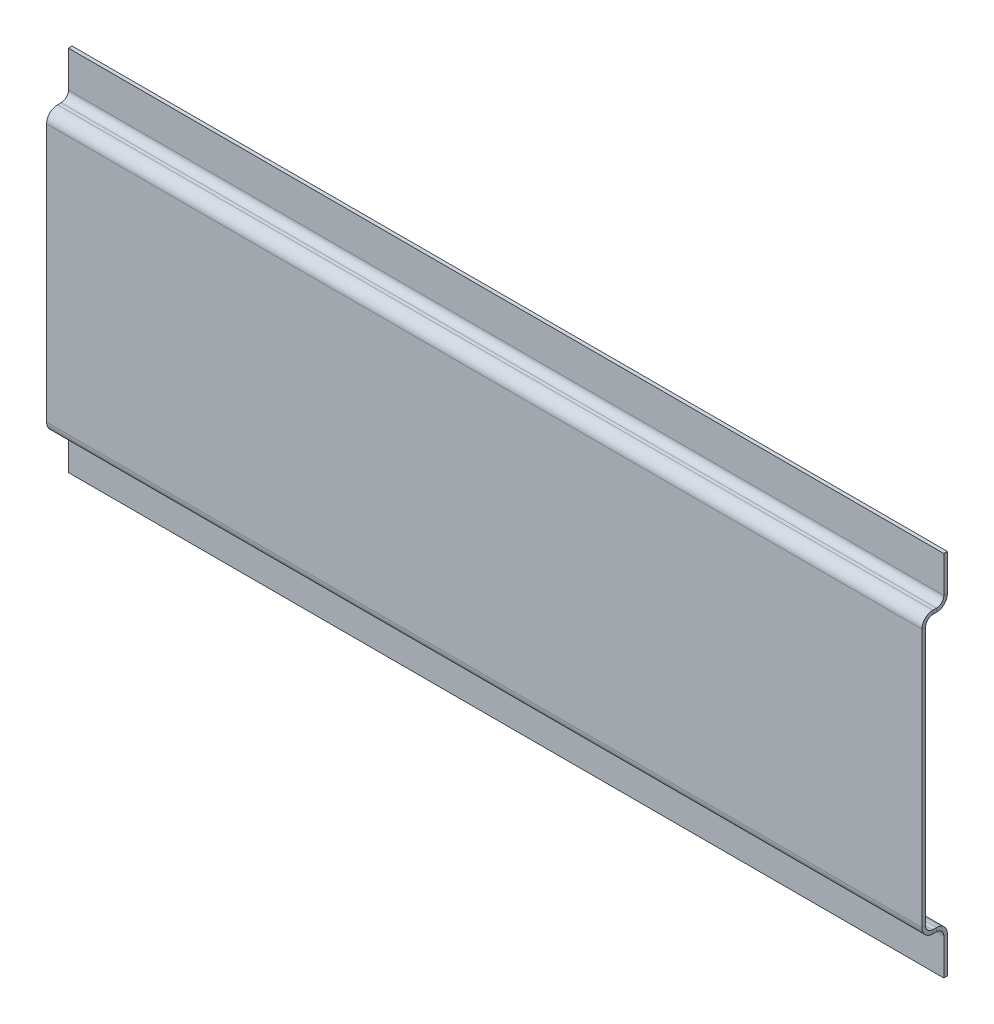
ISO-10303-21;
HEADER;
FILE_DESCRIPTION(('STEP AP214'),'2;1');
FILE_NAME('part.step','',(''),(''),'','','');
FILE_SCHEMA(('AUTOMOTIVE_DESIGN { 1 0 10303 214 1 1 1 1 }'));
ENDSEC;
DATA;
#1=APPLICATION_CONTEXT('core data for automotive mechanical design processes');
#2=APPLICATION_PROTOCOL_DEFINITION('international standard','automotive_design',2000,#1);
#3=PRODUCT_CONTEXT('',#1,'mechanical');
#4=PRODUCT('Part','Part','',(#3));
#5=PRODUCT_RELATED_PRODUCT_CATEGORY('part','',(#4));
#6=PRODUCT_DEFINITION_FORMATION('','',#4);
#7=PRODUCT_DEFINITION_CONTEXT('part definition',#1,'design');
#8=PRODUCT_DEFINITION('design','',#6,#7);
#9=PRODUCT_DEFINITION_SHAPE('','',#8);
#10=(LENGTH_UNIT() NAMED_UNIT(*) SI_UNIT(.MILLI.,.METRE.));
#11=(NAMED_UNIT(*) PLANE_ANGLE_UNIT() SI_UNIT($,.RADIAN.));
#12=(NAMED_UNIT(*) SI_UNIT($,.STERADIAN.) SOLID_ANGLE_UNIT());
#13=UNCERTAINTY_MEASURE_WITH_UNIT(LENGTH_MEASURE(1.E-05),#10,'distance_accuracy_value','');
#14=(GEOMETRIC_REPRESENTATION_CONTEXT(3) GLOBAL_UNCERTAINTY_ASSIGNED_CONTEXT((#13)) GLOBAL_UNIT_ASSIGNED_CONTEXT((#10,
#11,#12)) REPRESENTATION_CONTEXT('',''));
#15=CARTESIAN_POINT('',(0.,0.,0.));
#16=DIRECTION('',(0.,0.,1.));
#17=DIRECTION('',(1.,0.,0.));
#18=AXIS2_PLACEMENT_3D('',#15,#16,#17);
#19=CARTESIAN_POINT('',(0.,3.8539816339745,5.00000000000001));
#20=DIRECTION('',(0.,0.,1.));
#21=DIRECTION('',(1.,0.,0.));
#22=AXIS2_PLACEMENT_3D('',#19,#20,#21);
#23=PLANE('',#22);
#24=DIRECTION('',(0.,1.,0.));
#25=VECTOR('',#24,1.);
#26=CARTESIAN_POINT('',(120.25,54.3539816339745,5.));
#27=LINE('',#26,#25);
#28=CARTESIAN_POINT('',(120.25,-35.5,5.));
#29=VERTEX_POINT('',#28);
#30=CARTESIAN_POINT('',(120.25,35.5,5.00000000000001));
#31=VERTEX_POINT('',#30);
#32=EDGE_CURVE('E278',#29,#31,#27,.T.);
#33=ORIENTED_EDGE('',*,*,#32,.F.);
#34=DIRECTION('',(-1.,0.,0.));
#35=VECTOR('',#34,1.);
#36=CARTESIAN_POINT('',(0.,-35.5,5.00000000000001));
#37=LINE('',#36,#35);
#38=CARTESIAN_POINT('',(-120.25,-35.5,5.00000000000001));
#39=VERTEX_POINT('',#38);
#40=EDGE_CURVE('E358',#29,#39,#37,.T.);
#41=ORIENTED_EDGE('',*,*,#40,.T.);
#42=DIRECTION('',(0.,-1.,0.));
#43=VECTOR('',#42,1.);
#44=CARTESIAN_POINT('',(-120.25,54.3539816339745,5.));
#45=LINE('',#44,#43);
#46=CARTESIAN_POINT('',(-120.25,35.5,5.00000000000001));
#47=VERTEX_POINT('',#46);
#48=EDGE_CURVE('E357',#47,#39,#45,.T.);
#49=ORIENTED_EDGE('',*,*,#48,.F.);
#50=DIRECTION('',(-1.,0.,0.));
#51=VECTOR('',#50,1.);
#52=CARTESIAN_POINT('',(0.,35.5,5.00000000000001));
#53=LINE('',#52,#51);
#54=EDGE_CURVE('E279',#31,#47,#53,.T.);
#55=ORIENTED_EDGE('',*,*,#54,.F.);
#56=EDGE_LOOP('',(#33,#41,#49,#55));
#57=FACE_BOUND('',#56,.T.);
#58=ADVANCED_FACE('F53',(#57),#23,.F.);
#59=CARTESIAN_POINT('',(0.,37.5000000000001,38.5730091830128));
#60=DIRECTION('',(0.,1.,0.));
#61=DIRECTION('',(1.,0.,0.));
#62=AXIS2_PLACEMENT_3D('',#59,#60,#61);
#63=PLANE('',#62);
#64=DIRECTION('',(0.,0.,-1.));
#65=VECTOR('',#64,1.);
#66=CARTESIAN_POINT('',(120.25,37.5,-11.9269908169872));
#67=LINE('',#66,#65);
#68=CARTESIAN_POINT('',(120.25,37.5,3.));
#69=VERTEX_POINT('',#68);
#70=CARTESIAN_POINT('',(120.25,37.5,2.));
#71=VERTEX_POINT('',#70);
#72=EDGE_CURVE('E258',#69,#71,#67,.T.);
#73=ORIENTED_EDGE('',*,*,#72,.F.);
#74=DIRECTION('',(-1.,0.,0.));
#75=VECTOR('',#74,1.);
#76=CARTESIAN_POINT('',(0.,37.5,3.));
#77=LINE('',#76,#75);
#78=CARTESIAN_POINT('',(-120.25,37.5,3.));
#79=VERTEX_POINT('',#78);
#80=EDGE_CURVE('E252',#69,#79,#77,.T.);
#81=ORIENTED_EDGE('',*,*,#80,.T.);
#82=DIRECTION('',(0.,0.,1.));
#83=VECTOR('',#82,1.);
#84=CARTESIAN_POINT('',(-120.25,37.5,-11.9269908169872));
#85=LINE('',#84,#83);
#86=CARTESIAN_POINT('',(-120.25,37.5,2.00000000000001));
#87=VERTEX_POINT('',#86);
#88=EDGE_CURVE('E264',#87,#79,#85,.T.);
#89=ORIENTED_EDGE('',*,*,#88,.F.);
#90=DIRECTION('',(-1.,0.,0.));
#91=VECTOR('',#90,1.);
#92=CARTESIAN_POINT('',(0.,37.5,2.));
#93=LINE('',#92,#91);
#94=EDGE_CURVE('E292',#71,#87,#93,.T.);
#95=ORIENTED_EDGE('',*,*,#94,.F.);
#96=EDGE_LOOP('',(#73,#81,#89,#95));
#97=FACE_BOUND('',#96,.T.);
#98=ADVANCED_FACE('F432',(#97),#63,.F.);
#99=CARTESIAN_POINT('',(120.25,37.5,-11.9269908169872));
#100=DIRECTION('',(1.,0.,0.));
#101=DIRECTION('',(0.,0.,-1.));
#102=AXIS2_PLACEMENT_3D('',#99,#100,#101);
#103=PLANE('',#102);
#104=DIRECTION('',(0.,1.,0.));
#105=VECTOR('',#104,1.);
#106=CARTESIAN_POINT('',(120.25,37.4999999999999,3.));
#107=LINE('',#106,#105);
#108=CARTESIAN_POINT('',(120.25,38.5,3.));
#109=VERTEX_POINT('',#108);
#110=EDGE_CURVE('E280',#69,#109,#107,.T.);
#111=ORIENTED_EDGE('',*,*,#110,.F.);
#112=ORIENTED_EDGE('',*,*,#72,.T.);
#113=DIRECTION('',(0.,1.,0.));
#114=VECTOR('',#113,1.);
#115=CARTESIAN_POINT('',(120.25,37.4999999999999,2.));
#116=LINE('',#115,#114);
#117=CARTESIAN_POINT('',(120.25,38.5,2.));
#118=VERTEX_POINT('',#117);
#119=EDGE_CURVE('E260',#71,#118,#116,.T.);
#120=ORIENTED_EDGE('',*,*,#119,.T.);
#121=DIRECTION('',(0.,0.,-1.));
#122=VECTOR('',#121,1.);
#123=CARTESIAN_POINT('',(120.25,38.5,-11.9269908169873));
#124=LINE('',#123,#122);
#125=EDGE_CURVE('E261',#109,#118,#124,.T.);
#126=ORIENTED_EDGE('',*,*,#125,.F.);
#127=EDGE_LOOP('',(#111,#112,#120,#126));
#128=FACE_BOUND('',#127,.T.);
#129=ADVANCED_FACE('F474',(#128),#103,.T.);
#130=CARTESIAN_POINT('',(-120.25,37.5,-11.9269908169872));
#131=DIRECTION('',(-1.,0.,0.));
#132=DIRECTION('',(0.,0.,1.));
#133=AXIS2_PLACEMENT_3D('',#130,#131,#132);
#134=PLANE('',#133);
#135=DIRECTION('',(0.,-1.,0.));
#136=VECTOR('',#135,1.);
#137=CARTESIAN_POINT('',(-120.25,37.4999999999999,3.));
#138=LINE('',#137,#136);
#139=CARTESIAN_POINT('',(-120.25,38.5,3.00000000000001));
#140=VERTEX_POINT('',#139);
#141=EDGE_CURVE('E270',#140,#79,#138,.T.);
#142=ORIENTED_EDGE('',*,*,#141,.F.);
#143=DIRECTION('',(0.,0.,1.));
#144=VECTOR('',#143,1.);
#145=CARTESIAN_POINT('',(-120.25,38.5,-11.9269908169872));
#146=LINE('',#145,#144);
#147=CARTESIAN_POINT('',(-120.25,38.5,2.00000000000001));
#148=VERTEX_POINT('',#147);
#149=EDGE_CURVE('E265',#148,#140,#146,.T.);
#150=ORIENTED_EDGE('',*,*,#149,.F.);
#151=DIRECTION('',(0.,-1.,0.));
#152=VECTOR('',#151,1.);
#153=CARTESIAN_POINT('',(-120.25,37.4999999999999,2.00000000000001));
#154=LINE('',#153,#152);
#155=EDGE_CURVE('E269',#148,#87,#154,.T.);
#156=ORIENTED_EDGE('',*,*,#155,.T.);
#157=ORIENTED_EDGE('',*,*,#88,.T.);
#158=EDGE_LOOP('',(#142,#150,#156,#157));
#159=FACE_BOUND('',#158,.T.);
#160=ADVANCED_FACE('F440',(#159),#134,.T.);
#161=CARTESIAN_POINT('',(0.,38.5000000000001,38.5730091830128));
#162=DIRECTION('',(0.,1.,0.));
#163=DIRECTION('',(1.,0.,0.));
#164=AXIS2_PLACEMENT_3D('',#161,#162,#163);
#165=PLANE('',#164);
#166=DIRECTION('',(-1.,0.,0.));
#167=VECTOR('',#166,1.);
#168=CARTESIAN_POINT('',(0.,38.5,3.));
#169=LINE('',#168,#167);
#170=EDGE_CURVE('E275',#109,#140,#169,.T.);
#171=ORIENTED_EDGE('',*,*,#170,.F.);
#172=ORIENTED_EDGE('',*,*,#125,.T.);
#173=DIRECTION('',(-1.,0.,0.));
#174=VECTOR('',#173,1.);
#175=CARTESIAN_POINT('',(0.,38.5,2.));
#176=LINE('',#175,#174);
#177=EDGE_CURVE('E263',#118,#148,#176,.T.);
#178=ORIENTED_EDGE('',*,*,#177,.T.);
#179=ORIENTED_EDGE('',*,*,#149,.T.);
#180=EDGE_LOOP('',(#171,#172,#178,#179));
#181=FACE_BOUND('',#180,.T.);
#182=ADVANCED_FACE('F479',(#181),#165,.T.);
#183=CARTESIAN_POINT('',(-120.25,50.5,-1.));
#184=DIRECTION('',(0.,1.,0.));
#185=DIRECTION('',(0.,0.,1.));
#186=AXIS2_PLACEMENT_3D('',#183,#184,#185);
#187=PLANE('',#186);
#188=DIRECTION('',(-1.,0.,0.));
#189=VECTOR('',#188,1.);
#190=CARTESIAN_POINT('',(-120.25,50.5,0.));
#191=LINE('',#190,#189);
#192=CARTESIAN_POINT('',(120.25,50.5,0.));
#193=VERTEX_POINT('',#192);
#194=CARTESIAN_POINT('',(-120.25,50.5,0.));
#195=VERTEX_POINT('',#194);
#196=EDGE_CURVE('E319',#193,#195,#191,.T.);
#197=ORIENTED_EDGE('',*,*,#196,.F.);
#198=DIRECTION('',(0.,0.,1.));
#199=VECTOR('',#198,1.);
#200=CARTESIAN_POINT('',(120.25,50.5,-1.));
#201=LINE('',#200,#199);
#202=CARTESIAN_POINT('',(120.25,50.5,-1.));
#203=VERTEX_POINT('',#202);
#204=EDGE_CURVE('E300',#203,#193,#201,.T.);
#205=ORIENTED_EDGE('',*,*,#204,.F.);
#206=DIRECTION('',(-1.,0.,0.));
#207=VECTOR('',#206,1.);
#208=CARTESIAN_POINT('',(-120.25,50.5,-1.));
#209=LINE('',#208,#207);
#210=CARTESIAN_POINT('',(-120.25,50.5,-1.));
#211=VERTEX_POINT('',#210);
#212=EDGE_CURVE('E267',#203,#211,#209,.T.);
#213=ORIENTED_EDGE('',*,*,#212,.T.);
#214=DIRECTION('',(0.,0.,1.));
#215=VECTOR('',#214,1.);
#216=CARTESIAN_POINT('',(-120.25,50.5,-1.));
#217=LINE('',#216,#215);
#218=EDGE_CURVE('E310',#211,#195,#217,.T.);
#219=ORIENTED_EDGE('',*,*,#218,.T.);
#220=EDGE_LOOP('',(#197,#205,#213,#219));
#221=FACE_BOUND('',#220,.T.);
#222=ADVANCED_FACE('F467',(#221),#187,.T.);
#223=CARTESIAN_POINT('',(0.,0.,-1.));
#224=DIRECTION('',(0.,0.,1.));
#225=DIRECTION('',(1.,0.,0.));
#226=AXIS2_PLACEMENT_3D('',#223,#224,#225);
#227=PLANE('',#226);
#228=DIRECTION('',(0.,1.,0.));
#229=VECTOR('',#228,1.);
#230=CARTESIAN_POINT('',(120.25,50.5,-1.));
#231=LINE('',#230,#229);
#232=CARTESIAN_POINT('',(120.25,40.5,-1.));
#233=VERTEX_POINT('',#232);
#234=EDGE_CURVE('E324',#233,#203,#231,.T.);
#235=ORIENTED_EDGE('',*,*,#234,.F.);
#236=DIRECTION('',(-1.,0.,0.));
#237=VECTOR('',#236,1.);
#238=CARTESIAN_POINT('',(0.,40.5,-1.));
#239=LINE('',#238,#237);
#240=CARTESIAN_POINT('',(-120.25,40.5,-1.));
#241=VERTEX_POINT('',#240);
#242=EDGE_CURVE('E312',#233,#241,#239,.T.);
#243=ORIENTED_EDGE('',*,*,#242,.T.);
#244=DIRECTION('',(0.,-1.,0.));
#245=VECTOR('',#244,1.);
#246=CARTESIAN_POINT('',(-120.25,50.5,-1.));
#247=LINE('',#246,#245);
#248=EDGE_CURVE('E315',#211,#241,#247,.T.);
#249=ORIENTED_EDGE('',*,*,#248,.F.);
#250=ORIENTED_EDGE('',*,*,#212,.F.);
#251=EDGE_LOOP('',(#235,#243,#249,#250));
#252=FACE_BOUND('',#251,.T.);
#253=ADVANCED_FACE('F486',(#252),#227,.F.);
#254=CARTESIAN_POINT('',(-120.25,50.5,-1.));
#255=DIRECTION('',(-1.,0.,0.));
#256=DIRECTION('',(0.,-1.,0.));
#257=AXIS2_PLACEMENT_3D('',#254,#255,#256);
#258=PLANE('',#257);
#259=DIRECTION('',(0.,0.,-1.));
#260=VECTOR('',#259,1.);
#261=CARTESIAN_POINT('',(-120.25,40.5,-1.00000000000007));
#262=LINE('',#261,#260);
#263=CARTESIAN_POINT('',(-120.25,40.5,0.));
#264=VERTEX_POINT('',#263);
#265=EDGE_CURVE('E303',#264,#241,#262,.T.);
#266=ORIENTED_EDGE('',*,*,#265,.F.);
#267=DIRECTION('',(0.,-1.,0.));
#268=VECTOR('',#267,1.);
#269=CARTESIAN_POINT('',(-120.25,50.5,0.));
#270=LINE('',#269,#268);
#271=EDGE_CURVE('E322',#195,#264,#270,.T.);
#272=ORIENTED_EDGE('',*,*,#271,.F.);
#273=ORIENTED_EDGE('',*,*,#218,.F.);
#274=ORIENTED_EDGE('',*,*,#248,.T.);
#275=EDGE_LOOP('',(#266,#272,#273,#274));
#276=FACE_BOUND('',#275,.T.);
#277=ADVANCED_FACE('F470',(#276),#258,.T.);
#278=CARTESIAN_POINT('',(0.,0.,0.));
#279=DIRECTION('',(0.,0.,1.));
#280=DIRECTION('',(1.,0.,0.));
#281=AXIS2_PLACEMENT_3D('',#278,#279,#280);
#282=PLANE('',#281);
#283=DIRECTION('',(-1.,0.,0.));
#284=VECTOR('',#283,1.);
#285=CARTESIAN_POINT('',(0.,40.5,0.));
#286=LINE('',#285,#284);
#287=CARTESIAN_POINT('',(120.25,40.5,0.));
#288=VERTEX_POINT('',#287);
#289=EDGE_CURVE('E284',#288,#264,#286,.T.);
#290=ORIENTED_EDGE('',*,*,#289,.F.);
#291=DIRECTION('',(0.,1.,0.));
#292=VECTOR('',#291,1.);
#293=CARTESIAN_POINT('',(120.25,50.5,0.));
#294=LINE('',#293,#292);
#295=EDGE_CURVE('E317',#288,#193,#294,.T.);
#296=ORIENTED_EDGE('',*,*,#295,.T.);
#297=ORIENTED_EDGE('',*,*,#196,.T.);
#298=ORIENTED_EDGE('',*,*,#271,.T.);
#299=EDGE_LOOP('',(#290,#296,#297,#298));
#300=FACE_BOUND('',#299,.T.);
#301=ADVANCED_FACE('F452',(#300),#282,.T.);
#302=CARTESIAN_POINT('',(120.25,50.5,-1.));
#303=DIRECTION('',(1.,0.,0.));
#304=DIRECTION('',(0.,1.,0.));
#305=AXIS2_PLACEMENT_3D('',#302,#303,#304);
#306=PLANE('',#305);
#307=DIRECTION('',(0.,0.,1.));
#308=VECTOR('',#307,1.);
#309=CARTESIAN_POINT('',(120.25,40.5,-1.00000000000007));
#310=LINE('',#309,#308);
#311=EDGE_CURVE('E296',#233,#288,#310,.T.);
#312=ORIENTED_EDGE('',*,*,#311,.F.);
#313=ORIENTED_EDGE('',*,*,#234,.T.);
#314=ORIENTED_EDGE('',*,*,#204,.T.);
#315=ORIENTED_EDGE('',*,*,#295,.F.);
#316=EDGE_LOOP('',(#312,#313,#314,#315));
#317=FACE_BOUND('',#316,.T.);
#318=ADVANCED_FACE('F462',(#317),#306,.T.);
#319=CARTESIAN_POINT('',(120.25,40.5,2.));
#320=DIRECTION('',(1.,0.,0.));
#321=DIRECTION('',(0.,0.,-1.));
#322=AXIS2_PLACEMENT_3D('',#319,#320,#321);
#323=PLANE('',#322);
#324=ORIENTED_EDGE('',*,*,#311,.T.);
#325=CARTESIAN_POINT('',(120.25,40.5,2.));
#326=DIRECTION('',(-1.,0.,0.));
#327=DIRECTION('',(0.,-1.,0.));
#328=AXIS2_PLACEMENT_3D('',#325,#326,#327);
#329=CIRCLE('',#328,2.);
#330=EDGE_CURVE('E299',#288,#118,#329,.T.);
#331=ORIENTED_EDGE('',*,*,#330,.T.);
#332=ORIENTED_EDGE('',*,*,#119,.F.);
#333=CARTESIAN_POINT('',(120.25,40.5,2.));
#334=DIRECTION('',(-1.,0.,0.));
#335=DIRECTION('',(0.,0.,-1.));
#336=AXIS2_PLACEMENT_3D('',#333,#334,#335);
#337=CIRCLE('',#336,3.);
#338=EDGE_CURVE('E295',#233,#71,#337,.T.);
#339=ORIENTED_EDGE('',*,*,#338,.F.);
#340=EDGE_LOOP('',(#324,#331,#332,#339));
#341=FACE_BOUND('',#340,.T.);
#342=ADVANCED_FACE('F458',(#341),#323,.T.);
#343=CARTESIAN_POINT('',(-120.25,40.5,2.));
#344=DIRECTION('',(-1.,0.,0.));
#345=DIRECTION('',(0.,0.,1.));
#346=AXIS2_PLACEMENT_3D('',#343,#344,#345);
#347=PLANE('',#346);
#348=ORIENTED_EDGE('',*,*,#155,.F.);
#349=CARTESIAN_POINT('',(-120.25,40.5,2.));
#350=DIRECTION('',(-1.,0.,0.));
#351=DIRECTION('',(0.,-1.,0.));
#352=AXIS2_PLACEMENT_3D('',#349,#350,#351);
#353=CIRCLE('',#352,2.);
#354=EDGE_CURVE('E307',#148,#264,#353,.F.);
#355=ORIENTED_EDGE('',*,*,#354,.T.);
#356=ORIENTED_EDGE('',*,*,#265,.T.);
#357=CARTESIAN_POINT('',(-120.25,40.5,2.));
#358=DIRECTION('',(1.,0.,0.));
#359=DIRECTION('',(0.,0.,1.));
#360=AXIS2_PLACEMENT_3D('',#357,#358,#359);
#361=CIRCLE('',#360,3.);
#362=EDGE_CURVE('E306',#87,#241,#361,.T.);
#363=ORIENTED_EDGE('',*,*,#362,.F.);
#364=EDGE_LOOP('',(#348,#355,#356,#363));
#365=FACE_BOUND('',#364,.T.);
#366=ADVANCED_FACE('F445',(#365),#347,.T.);
#367=CARTESIAN_POINT('',(240.534137404396,40.5,2.));
#368=DIRECTION('',(-1.,0.,0.));
#369=DIRECTION('',(0.,-1.,0.));
#370=AXIS2_PLACEMENT_3D('',#367,#368,#369);
#371=CYLINDRICAL_SURFACE('',#370,3.);
#372=ORIENTED_EDGE('',*,*,#362,.T.);
#373=ORIENTED_EDGE('',*,*,#242,.F.);
#374=ORIENTED_EDGE('',*,*,#338,.T.);
#375=ORIENTED_EDGE('',*,*,#94,.T.);
#376=EDGE_LOOP('',(#372,#373,#374,#375));
#377=FACE_BOUND('',#376,.T.);
#378=ADVANCED_FACE('F472',(#377),#371,.T.);
#379=CARTESIAN_POINT('',(240.534137404396,40.5,2.));
#380=DIRECTION('',(-1.,0.,0.));
#381=DIRECTION('',(0.,-1.,0.));
#382=AXIS2_PLACEMENT_3D('',#379,#380,#381);
#383=CYLINDRICAL_SURFACE('',#382,2.);
#384=ORIENTED_EDGE('',*,*,#354,.F.);
#385=ORIENTED_EDGE('',*,*,#177,.F.);
#386=ORIENTED_EDGE('',*,*,#330,.F.);
#387=ORIENTED_EDGE('',*,*,#289,.T.);
#388=EDGE_LOOP('',(#384,#385,#386,#387));
#389=FACE_BOUND('',#388,.T.);
#390=ADVANCED_FACE('F448',(#389),#383,.F.);
#391=CARTESIAN_POINT('',(120.25,35.5,3.00000000000001));
#392=DIRECTION('',(-1.,0.,0.));
#393=DIRECTION('',(0.,0.,1.));
#394=AXIS2_PLACEMENT_3D('',#391,#392,#393);
#395=PLANE('',#394);
#396=ORIENTED_EDGE('',*,*,#110,.T.);
#397=CARTESIAN_POINT('',(120.25,35.5,3.00000000000001));
#398=DIRECTION('',(-1.,0.,0.));
#399=DIRECTION('',(0.,-1.,0.));
#400=AXIS2_PLACEMENT_3D('',#397,#398,#399);
#401=CIRCLE('',#400,3.);
#402=CARTESIAN_POINT('',(120.25,35.5,6.00000000000001));
#403=VERTEX_POINT('',#402);
#404=EDGE_CURVE('E283',#109,#403,#401,.F.);
#405=ORIENTED_EDGE('',*,*,#404,.T.);
#406=DIRECTION('',(0.,0.,1.));
#407=VECTOR('',#406,1.);
#408=CARTESIAN_POINT('',(120.25,35.5,4.99999999999988));
#409=LINE('',#408,#407);
#410=EDGE_CURVE('E347',#31,#403,#409,.T.);
#411=ORIENTED_EDGE('',*,*,#410,.F.);
#412=CARTESIAN_POINT('',(120.25,35.5,3.00000000000001));
#413=DIRECTION('',(1.,0.,0.));
#414=DIRECTION('',(0.,0.,1.));
#415=AXIS2_PLACEMENT_3D('',#412,#413,#414);
#416=CIRCLE('',#415,2.);
#417=EDGE_CURVE('E342',#69,#31,#416,.T.);
#418=ORIENTED_EDGE('',*,*,#417,.F.);
#419=EDGE_LOOP('',(#396,#405,#411,#418));
#420=FACE_BOUND('',#419,.T.);
#421=ADVANCED_FACE('F426',(#420),#395,.F.);
#422=CARTESIAN_POINT('',(-120.25,35.5,3.00000000000001));
#423=DIRECTION('',(1.,0.,0.));
#424=DIRECTION('',(0.,0.,-1.));
#425=AXIS2_PLACEMENT_3D('',#422,#423,#424);
#426=PLANE('',#425);
#427=DIRECTION('',(0.,0.,-1.));
#428=VECTOR('',#427,1.);
#429=CARTESIAN_POINT('',(-120.25,35.5,4.99999999999988));
#430=LINE('',#429,#428);
#431=CARTESIAN_POINT('',(-120.25,35.5,6.00000000000001));
#432=VERTEX_POINT('',#431);
#433=EDGE_CURVE('E355',#432,#47,#430,.T.);
#434=ORIENTED_EDGE('',*,*,#433,.F.);
#435=CARTESIAN_POINT('',(-120.25,35.5,3.00000000000001));
#436=DIRECTION('',(-1.,0.,0.));
#437=DIRECTION('',(0.,-1.,0.));
#438=AXIS2_PLACEMENT_3D('',#435,#436,#437);
#439=CIRCLE('',#438,3.);
#440=EDGE_CURVE('E274',#432,#140,#439,.T.);
#441=ORIENTED_EDGE('',*,*,#440,.T.);
#442=ORIENTED_EDGE('',*,*,#141,.T.);
#443=CARTESIAN_POINT('',(-120.25,35.5,3.00000000000001));
#444=DIRECTION('',(-1.,0.,0.));
#445=DIRECTION('',(0.,0.,-1.));
#446=AXIS2_PLACEMENT_3D('',#443,#444,#445);
#447=CIRCLE('',#446,2.);
#448=EDGE_CURVE('E273',#47,#79,#447,.T.);
#449=ORIENTED_EDGE('',*,*,#448,.F.);
#450=EDGE_LOOP('',(#434,#441,#442,#449));
#451=FACE_BOUND('',#450,.T.);
#452=ADVANCED_FACE('F437',(#451),#426,.F.);
#453=CARTESIAN_POINT('',(240.534137404396,35.5,3.00000000000001));
#454=DIRECTION('',(-1.,0.,0.));
#455=DIRECTION('',(0.,-1.,0.));
#456=AXIS2_PLACEMENT_3D('',#453,#454,#455);
#457=CYLINDRICAL_SURFACE('',#456,2.);
#458=ORIENTED_EDGE('',*,*,#448,.T.);
#459=ORIENTED_EDGE('',*,*,#80,.F.);
#460=ORIENTED_EDGE('',*,*,#417,.T.);
#461=ORIENTED_EDGE('',*,*,#54,.T.);
#462=EDGE_LOOP('',(#458,#459,#460,#461));
#463=FACE_BOUND('',#462,.T.);
#464=ADVANCED_FACE('F429',(#463),#457,.F.);
#465=CARTESIAN_POINT('',(240.534137404396,35.5,3.00000000000001));
#466=DIRECTION('',(-1.,0.,0.));
#467=DIRECTION('',(0.,-1.,0.));
#468=AXIS2_PLACEMENT_3D('',#465,#466,#467);
#469=CYLINDRICAL_SURFACE('',#468,3.);
#470=ORIENTED_EDGE('',*,*,#440,.F.);
#471=DIRECTION('',(-1.,0.,0.));
#472=VECTOR('',#471,1.);
#473=CARTESIAN_POINT('',(0.,35.5,6.00000000000001));
#474=LINE('',#473,#472);
#475=EDGE_CURVE('E351',#403,#432,#474,.T.);
#476=ORIENTED_EDGE('',*,*,#475,.F.);
#477=ORIENTED_EDGE('',*,*,#404,.F.);
#478=ORIENTED_EDGE('',*,*,#170,.T.);
#479=EDGE_LOOP('',(#470,#476,#477,#478));
#480=FACE_BOUND('',#479,.T.);
#481=ADVANCED_FACE('F477',(#480),#469,.T.);
#482=CARTESIAN_POINT('',(120.25,54.3539816339745,5.));
#483=DIRECTION('',(1.,0.,0.));
#484=DIRECTION('',(0.,1.,0.));
#485=AXIS2_PLACEMENT_3D('',#482,#483,#484);
#486=PLANE('',#485);
#487=DIRECTION('',(0.,0.,1.));
#488=VECTOR('',#487,1.);
#489=CARTESIAN_POINT('',(120.25,-35.5,5.));
#490=LINE('',#489,#488);
#491=CARTESIAN_POINT('',(120.25,-35.5,6.00000000000001));
#492=VERTEX_POINT('',#491);
#493=EDGE_CURVE('E361',#29,#492,#490,.T.);
#494=ORIENTED_EDGE('',*,*,#493,.F.);
#495=ORIENTED_EDGE('',*,*,#32,.T.);
#496=ORIENTED_EDGE('',*,*,#410,.T.);
#497=DIRECTION('',(0.,1.,0.));
#498=VECTOR('',#497,1.);
#499=CARTESIAN_POINT('',(120.25,54.3539816339745,6.00000000000001));
#500=LINE('',#499,#498);
#501=EDGE_CURVE('E350',#492,#403,#500,.T.);
#502=ORIENTED_EDGE('',*,*,#501,.F.);
#503=EDGE_LOOP('',(#494,#495,#496,#502));
#504=FACE_BOUND('',#503,.T.);
#505=ADVANCED_FACE('F399',(#504),#486,.T.);
#506=CARTESIAN_POINT('',(0.,3.85398163397451,6.00000000000001));
#507=DIRECTION('',(0.,0.,1.));
#508=DIRECTION('',(1.,0.,0.));
#509=AXIS2_PLACEMENT_3D('',#506,#507,#508);
#510=PLANE('',#509);
#511=DIRECTION('',(-1.,0.,0.));
#512=VECTOR('',#511,1.);
#513=CARTESIAN_POINT('',(0.,-35.5,6.00000000000001));
#514=LINE('',#513,#512);
#515=CARTESIAN_POINT('',(-120.25,-35.5,6.00000000000001));
#516=VERTEX_POINT('',#515);
#517=EDGE_CURVE('E364',#492,#516,#514,.T.);
#518=ORIENTED_EDGE('',*,*,#517,.F.);
#519=ORIENTED_EDGE('',*,*,#501,.T.);
#520=ORIENTED_EDGE('',*,*,#475,.T.);
#521=DIRECTION('',(0.,-1.,0.));
#522=VECTOR('',#521,1.);
#523=CARTESIAN_POINT('',(-120.25,54.3539816339745,6.00000000000001));
#524=LINE('',#523,#522);
#525=EDGE_CURVE('E354',#432,#516,#524,.T.);
#526=ORIENTED_EDGE('',*,*,#525,.T.);
#527=EDGE_LOOP('',(#518,#519,#520,#526));
#528=FACE_BOUND('',#527,.T.);
#529=ADVANCED_FACE('F405',(#528),#510,.T.);
#530=CARTESIAN_POINT('',(-120.25,54.3539816339745,5.));
#531=DIRECTION('',(-1.,0.,0.));
#532=DIRECTION('',(0.,-1.,0.));
#533=AXIS2_PLACEMENT_3D('',#530,#531,#532);
#534=PLANE('',#533);
#535=DIRECTION('',(0.,0.,-1.));
#536=VECTOR('',#535,1.);
#537=CARTESIAN_POINT('',(-120.25,-35.5,5.));
#538=LINE('',#537,#536);
#539=EDGE_CURVE('E367',#516,#39,#538,.T.);
#540=ORIENTED_EDGE('',*,*,#539,.F.);
#541=ORIENTED_EDGE('',*,*,#525,.F.);
#542=ORIENTED_EDGE('',*,*,#433,.T.);
#543=ORIENTED_EDGE('',*,*,#48,.T.);
#544=EDGE_LOOP('',(#540,#541,#542,#543));
#545=FACE_BOUND('',#544,.T.);
#546=ADVANCED_FACE('F409',(#545),#534,.T.);
#547=CARTESIAN_POINT('',(120.25,-35.5,3.00000000000001));
#548=DIRECTION('',(-1.,0.,0.));
#549=DIRECTION('',(0.,0.,1.));
#550=AXIS2_PLACEMENT_3D('',#547,#548,#549);
#551=PLANE('',#550);
#552=ORIENTED_EDGE('',*,*,#493,.T.);
#553=CARTESIAN_POINT('',(120.25,-35.5,3.00000000000001));
#554=DIRECTION('',(-1.,0.,0.));
#555=DIRECTION('',(0.,0.,1.));
#556=AXIS2_PLACEMENT_3D('',#553,#554,#555);
#557=CIRCLE('',#556,3.);
#558=CARTESIAN_POINT('',(120.25,-38.5,3.));
#559=VERTEX_POINT('',#558);
#560=EDGE_CURVE('E255',#492,#559,#557,.F.);
#561=ORIENTED_EDGE('',*,*,#560,.T.);
#562=DIRECTION('',(0.,-1.,0.));
#563=VECTOR('',#562,1.);
#564=CARTESIAN_POINT('',(120.25,-37.5,3.));
#565=LINE('',#564,#563);
#566=CARTESIAN_POINT('',(120.25,-37.5,3.));
#567=VERTEX_POINT('',#566);
#568=EDGE_CURVE('E241',#567,#559,#565,.T.);
#569=ORIENTED_EDGE('',*,*,#568,.F.);
#570=CARTESIAN_POINT('',(120.25,-35.5,3.00000000000001));
#571=DIRECTION('',(1.,0.,0.));
#572=DIRECTION('',(0.,0.,1.));
#573=AXIS2_PLACEMENT_3D('',#570,#571,#572);
#574=CIRCLE('',#573,2.);
#575=EDGE_CURVE('E245',#29,#567,#574,.T.);
#576=ORIENTED_EDGE('',*,*,#575,.F.);
#577=EDGE_LOOP('',(#552,#561,#569,#576));
#578=FACE_BOUND('',#577,.T.);
#579=ADVANCED_FACE('F395',(#578),#551,.F.);
#580=CARTESIAN_POINT('',(-120.25,-35.5,3.00000000000001));
#581=DIRECTION('',(1.,0.,0.));
#582=DIRECTION('',(0.,0.,-1.));
#583=AXIS2_PLACEMENT_3D('',#580,#581,#582);
#584=PLANE('',#583);
#585=DIRECTION('',(0.,1.,0.));
#586=VECTOR('',#585,1.);
#587=CARTESIAN_POINT('',(-120.25,-37.5,3.));
#588=LINE('',#587,#586);
#589=CARTESIAN_POINT('',(-120.25,-38.5,3.));
#590=VERTEX_POINT('',#589);
#591=CARTESIAN_POINT('',(-120.25,-37.5,2.99999999999999));
#592=VERTEX_POINT('',#591);
#593=EDGE_CURVE('E236',#590,#592,#588,.T.);
#594=ORIENTED_EDGE('',*,*,#593,.F.);
#595=CARTESIAN_POINT('',(-120.25,-35.5,3.00000000000001));
#596=DIRECTION('',(-1.,0.,0.));
#597=DIRECTION('',(0.,0.,1.));
#598=AXIS2_PLACEMENT_3D('',#595,#596,#597);
#599=CIRCLE('',#598,3.);
#600=EDGE_CURVE('E249',#590,#516,#599,.T.);
#601=ORIENTED_EDGE('',*,*,#600,.T.);
#602=ORIENTED_EDGE('',*,*,#539,.T.);
#603=CARTESIAN_POINT('',(-120.25,-35.5,3.00000000000001));
#604=DIRECTION('',(-1.,0.,0.));
#605=DIRECTION('',(0.,0.,-1.));
#606=AXIS2_PLACEMENT_3D('',#603,#604,#605);
#607=CIRCLE('',#606,2.);
#608=EDGE_CURVE('E248',#592,#39,#607,.T.);
#609=ORIENTED_EDGE('',*,*,#608,.F.);
#610=EDGE_LOOP('',(#594,#601,#602,#609));
#611=FACE_BOUND('',#610,.T.);
#612=ADVANCED_FACE('F413',(#611),#584,.F.);
#613=CARTESIAN_POINT('',(240.534137404396,-35.5,3.00000000000001));
#614=DIRECTION('',(-1.,0.,0.));
#615=DIRECTION('',(0.,0.,1.));
#616=AXIS2_PLACEMENT_3D('',#613,#614,#615);
#617=CYLINDRICAL_SURFACE('',#616,2.);
#618=ORIENTED_EDGE('',*,*,#608,.T.);
#619=ORIENTED_EDGE('',*,*,#40,.F.);
#620=ORIENTED_EDGE('',*,*,#575,.T.);
#621=DIRECTION('',(-1.,0.,0.));
#622=VECTOR('',#621,1.);
#623=CARTESIAN_POINT('',(0.,-37.5,3.));
#624=LINE('',#623,#622);
#625=EDGE_CURVE('E231',#567,#592,#624,.T.);
#626=ORIENTED_EDGE('',*,*,#625,.T.);
#627=EDGE_LOOP('',(#618,#619,#620,#626));
#628=FACE_BOUND('',#627,.T.);
#629=ADVANCED_FACE('F420',(#628),#617,.F.);
#630=CARTESIAN_POINT('',(240.534137404396,-35.5,3.00000000000001));
#631=DIRECTION('',(-1.,0.,0.));
#632=DIRECTION('',(0.,0.,1.));
#633=AXIS2_PLACEMENT_3D('',#630,#631,#632);
#634=CYLINDRICAL_SURFACE('',#633,3.);
#635=ORIENTED_EDGE('',*,*,#600,.F.);
#636=DIRECTION('',(-1.,0.,0.));
#637=VECTOR('',#636,1.);
#638=CARTESIAN_POINT('',(0.,-38.5,3.));
#639=LINE('',#638,#637);
#640=EDGE_CURVE('E239',#559,#590,#639,.T.);
#641=ORIENTED_EDGE('',*,*,#640,.F.);
#642=ORIENTED_EDGE('',*,*,#560,.F.);
#643=ORIENTED_EDGE('',*,*,#517,.T.);
#644=EDGE_LOOP('',(#635,#641,#642,#643));
#645=FACE_BOUND('',#644,.T.);
#646=ADVANCED_FACE('F394',(#645),#634,.T.);
#647=CARTESIAN_POINT('',(0.,-37.5000000000002,46.2809724509618));
#648=DIRECTION('',(0.,-1.,0.));
#649=DIRECTION('',(1.,0.,0.));
#650=AXIS2_PLACEMENT_3D('',#647,#648,#649);
#651=PLANE('',#650);
#652=DIRECTION('',(0.,0.,1.));
#653=VECTOR('',#652,1.);
#654=CARTESIAN_POINT('',(120.25,-37.5000000000003,96.7809724509618));
#655=LINE('',#654,#653);
#656=CARTESIAN_POINT('',(120.25,-37.5,2.00000000000001));
#657=VERTEX_POINT('',#656);
#658=EDGE_CURVE('E57',#657,#567,#655,.T.);
#659=ORIENTED_EDGE('',*,*,#658,.F.);
#660=DIRECTION('',(-1.,0.,0.));
#661=VECTOR('',#660,1.);
#662=CARTESIAN_POINT('',(0.,-37.5,2.));
#663=LINE('',#662,#661);
#664=CARTESIAN_POINT('',(-120.25,-37.5,2.00000000000001));
#665=VERTEX_POINT('',#664);
#666=EDGE_CURVE('E370',#657,#665,#663,.T.);
#667=ORIENTED_EDGE('',*,*,#666,.T.);
#668=DIRECTION('',(0.,0.,-1.));
#669=VECTOR('',#668,1.);
#670=CARTESIAN_POINT('',(-120.25,-37.5000000000003,96.7809724509618));
#671=LINE('',#670,#669);
#672=EDGE_CURVE('E238',#592,#665,#671,.T.);
#673=ORIENTED_EDGE('',*,*,#672,.F.);
#674=ORIENTED_EDGE('',*,*,#625,.F.);
#675=EDGE_LOOP('',(#659,#667,#673,#674));
#676=FACE_BOUND('',#675,.T.);
#677=ADVANCED_FACE('F417',(#676),#651,.F.);
#678=CARTESIAN_POINT('',(120.25,-37.5000000000003,96.7809724509618));
#679=DIRECTION('',(1.,0.,0.));
#680=DIRECTION('',(0.,0.,1.));
#681=AXIS2_PLACEMENT_3D('',#678,#679,#680);
#682=PLANE('',#681);
#683=DIRECTION('',(0.,-1.,0.));
#684=VECTOR('',#683,1.);
#685=CARTESIAN_POINT('',(120.25,-37.5,2.00000000000001));
#686=LINE('',#685,#684);
#687=CARTESIAN_POINT('',(120.25,-38.5,2.00000000000001));
#688=VERTEX_POINT('',#687);
#689=EDGE_CURVE('E377',#657,#688,#686,.T.);
#690=ORIENTED_EDGE('',*,*,#689,.F.);
#691=ORIENTED_EDGE('',*,*,#658,.T.);
#692=ORIENTED_EDGE('',*,*,#568,.T.);
#693=DIRECTION('',(0.,0.,1.));
#694=VECTOR('',#693,1.);
#695=CARTESIAN_POINT('',(120.25,-38.5000000000003,96.7809724509618));
#696=LINE('',#695,#694);
#697=EDGE_CURVE('E78',#688,#559,#696,.T.);
#698=ORIENTED_EDGE('',*,*,#697,.F.);
#699=EDGE_LOOP('',(#690,#691,#692,#698));
#700=FACE_BOUND('',#699,.T.);
#701=ADVANCED_FACE('F387',(#700),#682,.T.);
#702=CARTESIAN_POINT('',(0.,-38.5000000000002,46.2809724509618));
#703=DIRECTION('',(0.,-1.,0.));
#704=DIRECTION('',(1.,0.,0.));
#705=AXIS2_PLACEMENT_3D('',#702,#703,#704);
#706=PLANE('',#705);
#707=DIRECTION('',(-1.,0.,0.));
#708=VECTOR('',#707,1.);
#709=CARTESIAN_POINT('',(0.,-38.5,2.));
#710=LINE('',#709,#708);
#711=CARTESIAN_POINT('',(-120.25,-38.5,2.00000000000001));
#712=VERTEX_POINT('',#711);
#713=EDGE_CURVE('E62',#688,#712,#710,.T.);
#714=ORIENTED_EDGE('',*,*,#713,.F.);
#715=ORIENTED_EDGE('',*,*,#697,.T.);
#716=ORIENTED_EDGE('',*,*,#640,.T.);
#717=DIRECTION('',(0.,0.,-1.));
#718=VECTOR('',#717,1.);
#719=CARTESIAN_POINT('',(-120.25,-38.5000000000003,96.7809724509618));
#720=LINE('',#719,#718);
#721=EDGE_CURVE('E70',#590,#712,#720,.T.);
#722=ORIENTED_EDGE('',*,*,#721,.T.);
#723=EDGE_LOOP('',(#714,#715,#716,#722));
#724=FACE_BOUND('',#723,.T.);
#725=ADVANCED_FACE('F383',(#724),#706,.T.);
#726=CARTESIAN_POINT('',(-120.25,-37.5000000000003,96.7809724509618));
#727=DIRECTION('',(-1.,0.,0.));
#728=DIRECTION('',(0.,0.,-1.));
#729=AXIS2_PLACEMENT_3D('',#726,#727,#728);
#730=PLANE('',#729);
#731=DIRECTION('',(0.,1.,0.));
#732=VECTOR('',#731,1.);
#733=CARTESIAN_POINT('',(-120.25,-37.5,2.00000000000001));
#734=LINE('',#733,#732);
#735=EDGE_CURVE('E12',#712,#665,#734,.T.);
#736=ORIENTED_EDGE('',*,*,#735,.F.);
#737=ORIENTED_EDGE('',*,*,#721,.F.);
#738=ORIENTED_EDGE('',*,*,#593,.T.);
#739=ORIENTED_EDGE('',*,*,#672,.T.);
#740=EDGE_LOOP('',(#736,#737,#738,#739));
#741=FACE_BOUND('',#740,.T.);
#742=ADVANCED_FACE('F55',(#741),#730,.T.);
#743=CARTESIAN_POINT('',(120.25,-40.5,1.99999999999999));
#744=DIRECTION('',(1.,0.,0.));
#745=DIRECTION('',(0.,0.,-1.));
#746=AXIS2_PLACEMENT_3D('',#743,#744,#745);
#747=PLANE('',#746);
#748=ORIENTED_EDGE('',*,*,#689,.T.);
#749=CARTESIAN_POINT('',(120.25,-40.5,1.99999999999999));
#750=DIRECTION('',(-1.,0.,0.));
#751=DIRECTION('',(0.,0.,1.));
#752=AXIS2_PLACEMENT_3D('',#749,#750,#751);
#753=CIRCLE('',#752,2.);
#754=CARTESIAN_POINT('',(120.25,-40.5,0.));
#755=VERTEX_POINT('',#754);
#756=EDGE_CURVE('E211',#688,#755,#753,.T.);
#757=ORIENTED_EDGE('',*,*,#756,.T.);
#758=DIRECTION('',(0.,0.,1.));
#759=VECTOR('',#758,1.);
#760=CARTESIAN_POINT('',(120.25,-40.5,-1.00000000000001));
#761=LINE('',#760,#759);
#762=CARTESIAN_POINT('',(120.25,-40.5,-1.00000000000001));
#763=VERTEX_POINT('',#762);
#764=EDGE_CURVE('E852',#763,#755,#761,.T.);
#765=ORIENTED_EDGE('',*,*,#764,.F.);
#766=CARTESIAN_POINT('',(120.25,-40.5,1.99999999999999));
#767=DIRECTION('',(-1.,0.,0.));
#768=DIRECTION('',(0.,0.,-1.));
#769=AXIS2_PLACEMENT_3D('',#766,#767,#768);
#770=CIRCLE('',#769,3.);
#771=EDGE_CURVE('E224',#657,#763,#770,.T.);
#772=ORIENTED_EDGE('',*,*,#771,.F.);
#773=EDGE_LOOP('',(#748,#757,#765,#772));
#774=FACE_BOUND('',#773,.T.);
#775=ADVANCED_FACE('F506',(#774),#747,.T.);
#776=CARTESIAN_POINT('',(-120.25,-40.5,1.99999999999999));
#777=DIRECTION('',(-1.,0.,0.));
#778=DIRECTION('',(0.,0.,1.));
#779=AXIS2_PLACEMENT_3D('',#776,#777,#778);
#780=PLANE('',#779);
#781=DIRECTION('',(0.,0.,-1.));
#782=VECTOR('',#781,1.);
#783=CARTESIAN_POINT('',(-120.25,-40.5,-1.00000000000001));
#784=LINE('',#783,#782);
#785=CARTESIAN_POINT('',(-120.25,-40.5,0.));
#786=VERTEX_POINT('',#785);
#787=CARTESIAN_POINT('',(-120.25,-40.5,-1.00000000000001));
#788=VERTEX_POINT('',#787);
#789=EDGE_CURVE('E199',#786,#788,#784,.T.);
#790=ORIENTED_EDGE('',*,*,#789,.F.);
#791=CARTESIAN_POINT('',(-120.25,-40.5,1.99999999999999));
#792=DIRECTION('',(-1.,0.,0.));
#793=DIRECTION('',(0.,0.,1.));
#794=AXIS2_PLACEMENT_3D('',#791,#792,#793);
#795=CIRCLE('',#794,2.);
#796=EDGE_CURVE('E228',#786,#712,#795,.F.);
#797=ORIENTED_EDGE('',*,*,#796,.T.);
#798=ORIENTED_EDGE('',*,*,#735,.T.);
#799=CARTESIAN_POINT('',(-120.25,-40.5,1.99999999999999));
#800=DIRECTION('',(1.,0.,0.));
#801=DIRECTION('',(0.,0.,1.));
#802=AXIS2_PLACEMENT_3D('',#799,#800,#801);
#803=CIRCLE('',#802,3.);
#804=EDGE_CURVE('E227',#788,#665,#803,.T.);
#805=ORIENTED_EDGE('',*,*,#804,.F.);
#806=EDGE_LOOP('',(#790,#797,#798,#805));
#807=FACE_BOUND('',#806,.T.);
#808=ADVANCED_FACE('F510',(#807),#780,.T.);
#809=CARTESIAN_POINT('',(240.534137404396,-40.5,1.99999999999999));
#810=DIRECTION('',(-1.,0.,0.));
#811=DIRECTION('',(0.,0.,1.));
#812=AXIS2_PLACEMENT_3D('',#809,#810,#811);
#813=CYLINDRICAL_SURFACE('',#812,3.);
#814=ORIENTED_EDGE('',*,*,#804,.T.);
#815=ORIENTED_EDGE('',*,*,#666,.F.);
#816=ORIENTED_EDGE('',*,*,#771,.T.);
#817=DIRECTION('',(-1.,0.,0.));
#818=VECTOR('',#817,1.);
#819=CARTESIAN_POINT('',(0.,-40.5,-1.00000000000001));
#820=LINE('',#819,#818);
#821=EDGE_CURVE('E218',#763,#788,#820,.T.);
#822=ORIENTED_EDGE('',*,*,#821,.T.);
#823=EDGE_LOOP('',(#814,#815,#816,#822));
#824=FACE_BOUND('',#823,.T.);
#825=ADVANCED_FACE('F516',(#824),#813,.T.);
#826=CARTESIAN_POINT('',(240.534137404396,-40.5,1.99999999999999));
#827=DIRECTION('',(-1.,0.,0.));
#828=DIRECTION('',(0.,0.,1.));
#829=AXIS2_PLACEMENT_3D('',#826,#827,#828);
#830=CYLINDRICAL_SURFACE('',#829,2.);
#831=ORIENTED_EDGE('',*,*,#796,.F.);
#832=DIRECTION('',(-1.,0.,0.));
#833=VECTOR('',#832,1.);
#834=CARTESIAN_POINT('',(0.,-40.5,0.));
#835=LINE('',#834,#833);
#836=EDGE_CURVE('E851',#755,#786,#835,.T.);
#837=ORIENTED_EDGE('',*,*,#836,.F.);
#838=ORIENTED_EDGE('',*,*,#756,.F.);
#839=ORIENTED_EDGE('',*,*,#713,.T.);
#840=EDGE_LOOP('',(#831,#837,#838,#839));
#841=FACE_BOUND('',#840,.T.);
#842=ADVANCED_FACE('F747',(#841),#830,.F.);
#843=CARTESIAN_POINT('',(-120.25,-50.5,-1.00000000000001));
#844=DIRECTION('',(0.,-1.,0.));
#845=DIRECTION('',(0.,0.,-1.));
#846=AXIS2_PLACEMENT_3D('',#843,#844,#845);
#847=PLANE('',#846);
#848=DIRECTION('',(1.,0.,0.));
#849=VECTOR('',#848,1.);
#850=CARTESIAN_POINT('',(-120.25,-50.5,0.));
#851=LINE('',#850,#849);
#852=CARTESIAN_POINT('',(-120.25,-50.5,0.));
#853=VERTEX_POINT('',#852);
#854=CARTESIAN_POINT('',(120.25,-50.5,0.));
#855=VERTEX_POINT('',#854);
#856=EDGE_CURVE('E210',#853,#855,#851,.T.);
#857=ORIENTED_EDGE('',*,*,#856,.F.);
#858=DIRECTION('',(0.,0.,1.));
#859=VECTOR('',#858,1.);
#860=CARTESIAN_POINT('',(-120.25,-50.5,-1.00000000000001));
#861=LINE('',#860,#859);
#862=CARTESIAN_POINT('',(-120.25,-50.5,-1.00000000000001));
#863=VERTEX_POINT('',#862);
#864=EDGE_CURVE('E196',#863,#853,#861,.T.);
#865=ORIENTED_EDGE('',*,*,#864,.F.);
#866=DIRECTION('',(1.,0.,0.));
#867=VECTOR('',#866,1.);
#868=CARTESIAN_POINT('',(-120.25,-50.5,-1.00000000000001));
#869=LINE('',#868,#867);
#870=CARTESIAN_POINT('',(120.25,-50.5,-1.00000000000001));
#871=VERTEX_POINT('',#870);
#872=EDGE_CURVE('E208',#863,#871,#869,.T.);
#873=ORIENTED_EDGE('',*,*,#872,.T.);
#874=DIRECTION('',(0.,0.,1.));
#875=VECTOR('',#874,1.);
#876=CARTESIAN_POINT('',(120.25,-50.5,-1.00000000000001));
#877=LINE('',#876,#875);
#878=EDGE_CURVE('E217',#871,#855,#877,.T.);
#879=ORIENTED_EDGE('',*,*,#878,.T.);
#880=EDGE_LOOP('',(#857,#865,#873,#879));
#881=FACE_BOUND('',#880,.T.);
#882=ADVANCED_FACE('F206',(#881),#847,.T.);
#883=CARTESIAN_POINT('',(0.,7.70796326794901,-1.00000000000001));
#884=DIRECTION('',(0.,0.,1.));
#885=DIRECTION('',(1.,0.,0.));
#886=AXIS2_PLACEMENT_3D('',#883,#884,#885);
#887=PLANE('',#886);
#888=ORIENTED_EDGE('',*,*,#821,.F.);
#889=DIRECTION('',(0.,1.,0.));
#890=VECTOR('',#889,1.);
#891=CARTESIAN_POINT('',(120.25,58.207963267949,-1.00000000000002));
#892=LINE('',#891,#890);
#893=EDGE_CURVE('E215',#871,#763,#892,.T.);
#894=ORIENTED_EDGE('',*,*,#893,.F.);
#895=ORIENTED_EDGE('',*,*,#872,.F.);
#896=DIRECTION('',(0.,-1.,0.));
#897=VECTOR('',#896,1.);
#898=CARTESIAN_POINT('',(-120.25,58.207963267949,-1.00000000000002));
#899=LINE('',#898,#897);
#900=EDGE_CURVE('E193',#788,#863,#899,.T.);
#901=ORIENTED_EDGE('',*,*,#900,.F.);
#902=EDGE_LOOP('',(#888,#894,#895,#901));
#903=FACE_BOUND('',#902,.T.);
#904=ADVANCED_FACE('F213',(#903),#887,.F.);
#905=CARTESIAN_POINT('',(120.25,58.207963267949,-1.00000000000002));
#906=DIRECTION('',(1.,0.,0.));
#907=DIRECTION('',(0.,1.,0.));
#908=AXIS2_PLACEMENT_3D('',#905,#906,#907);
#909=PLANE('',#908);
#910=ORIENTED_EDGE('',*,*,#893,.T.);
#911=ORIENTED_EDGE('',*,*,#764,.T.);
#912=DIRECTION('',(0.,1.,0.));
#913=VECTOR('',#912,1.);
#914=CARTESIAN_POINT('',(120.25,58.207963267949,0.));
#915=LINE('',#914,#913);
#916=EDGE_CURVE('E848',#855,#755,#915,.T.);
#917=ORIENTED_EDGE('',*,*,#916,.F.);
#918=ORIENTED_EDGE('',*,*,#878,.F.);
#919=EDGE_LOOP('',(#910,#911,#917,#918));
#920=FACE_BOUND('',#919,.T.);
#921=ADVANCED_FACE('F777',(#920),#909,.T.);
#922=CARTESIAN_POINT('',(0.,7.70796326794901,0.));
#923=DIRECTION('',(0.,0.,1.));
#924=DIRECTION('',(1.,0.,0.));
#925=AXIS2_PLACEMENT_3D('',#922,#923,#924);
#926=PLANE('',#925);
#927=ORIENTED_EDGE('',*,*,#916,.T.);
#928=ORIENTED_EDGE('',*,*,#836,.T.);
#929=DIRECTION('',(0.,-1.,0.));
#930=VECTOR('',#929,1.);
#931=CARTESIAN_POINT('',(-120.25,58.207963267949,0.));
#932=LINE('',#931,#930);
#933=EDGE_CURVE('E859',#786,#853,#932,.T.);
#934=ORIENTED_EDGE('',*,*,#933,.T.);
#935=ORIENTED_EDGE('',*,*,#856,.T.);
#936=EDGE_LOOP('',(#927,#928,#934,#935));
#937=FACE_BOUND('',#936,.T.);
#938=ADVANCED_FACE('F787',(#937),#926,.T.);
#939=CARTESIAN_POINT('',(-120.25,58.207963267949,-1.00000000000002));
#940=DIRECTION('',(-1.,0.,0.));
#941=DIRECTION('',(0.,-1.,0.));
#942=AXIS2_PLACEMENT_3D('',#939,#940,#941);
#943=PLANE('',#942);
#944=ORIENTED_EDGE('',*,*,#933,.F.);
#945=ORIENTED_EDGE('',*,*,#789,.T.);
#946=ORIENTED_EDGE('',*,*,#900,.T.);
#947=ORIENTED_EDGE('',*,*,#864,.T.);
#948=EDGE_LOOP('',(#944,#945,#946,#947));
#949=FACE_BOUND('',#948,.T.);
#950=ADVANCED_FACE('F195',(#949),#943,.T.);
#951=CLOSED_SHELL('',(#58,#98,#129,#160,#182,#222,#253,#277,#301,#318,#342,#366,#378,#390,#421,
#452,#464,#481,#505,#529,#546,#579,#612,#629,#646,#677,#701,#725,#742,#775,#808,#825,#842,#882,
#904,#921,#938,#950));
#952=MANIFOLD_SOLID_BREP('B2',#951);
#953=ADVANCED_BREP_SHAPE_REPRESENTATION('',(#18,#952),#14);
#954=SHAPE_DEFINITION_REPRESENTATION(#9,#953);
ENDSEC;
END-ISO-10303-21;
